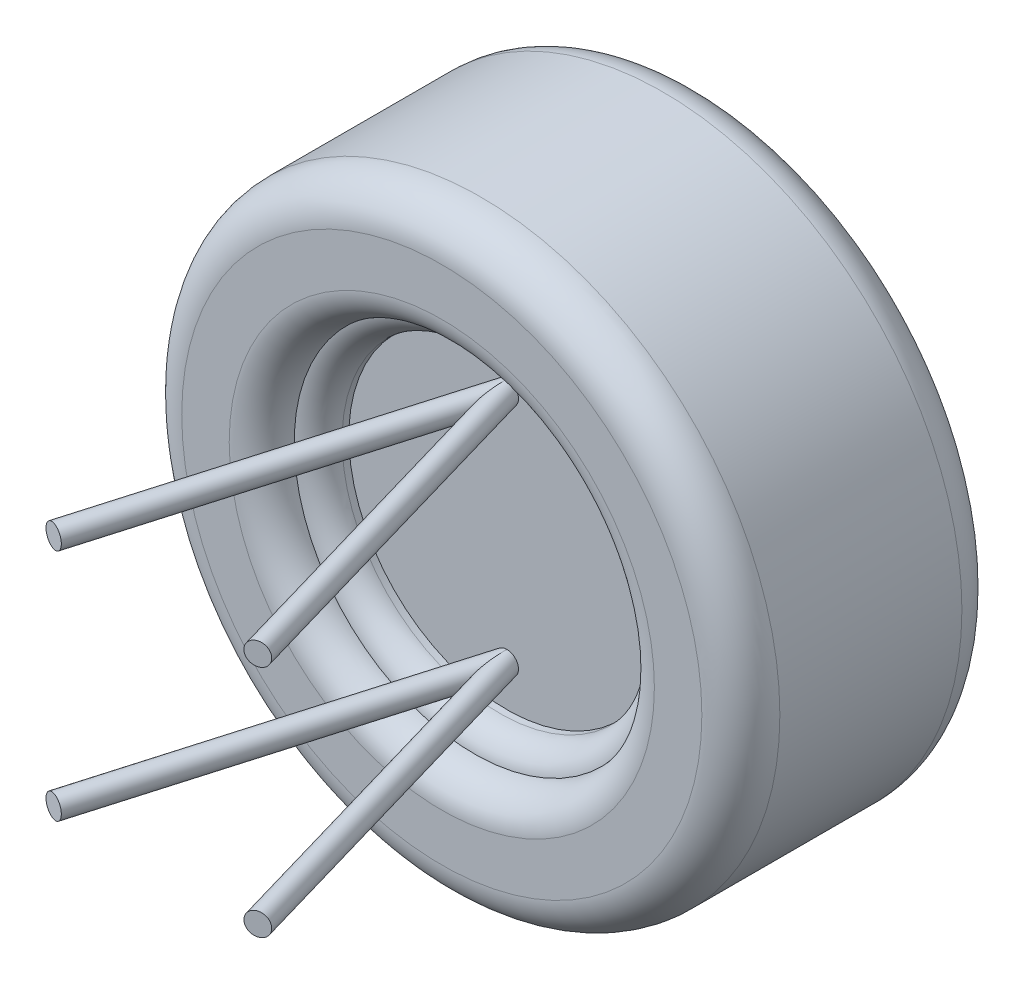
ISO-10303-21;
HEADER;
FILE_DESCRIPTION(('STEP AP214'),'2;1');
FILE_NAME('part.step','',(''),(''),'','','');
FILE_SCHEMA(('AUTOMOTIVE_DESIGN { 1 0 10303 214 1 1 1 1 }'));
ENDSEC;
DATA;
#1=APPLICATION_CONTEXT('core data for automotive mechanical design processes');
#2=APPLICATION_PROTOCOL_DEFINITION('international standard','automotive_design',2000,#1);
#3=PRODUCT_CONTEXT('',#1,'mechanical');
#4=PRODUCT('Part','Part','',(#3));
#5=PRODUCT_RELATED_PRODUCT_CATEGORY('part','',(#4));
#6=PRODUCT_DEFINITION_FORMATION('','',#4);
#7=PRODUCT_DEFINITION_CONTEXT('part definition',#1,'design');
#8=PRODUCT_DEFINITION('design','',#6,#7);
#9=PRODUCT_DEFINITION_SHAPE('','',#8);
#10=(LENGTH_UNIT() NAMED_UNIT(*) SI_UNIT(.MILLI.,.METRE.));
#11=(NAMED_UNIT(*) PLANE_ANGLE_UNIT() SI_UNIT($,.RADIAN.));
#12=(NAMED_UNIT(*) SI_UNIT($,.STERADIAN.) SOLID_ANGLE_UNIT());
#13=UNCERTAINTY_MEASURE_WITH_UNIT(LENGTH_MEASURE(1.E-05),#10,'distance_accuracy_value','');
#14=(GEOMETRIC_REPRESENTATION_CONTEXT(3) GLOBAL_UNCERTAINTY_ASSIGNED_CONTEXT((#13)) GLOBAL_UNIT_ASSIGNED_CONTEXT((#10,
#11,#12)) REPRESENTATION_CONTEXT('',''));
#15=CARTESIAN_POINT('',(0.,0.,0.));
#16=DIRECTION('',(0.,0.,1.));
#17=DIRECTION('',(1.,0.,0.));
#18=AXIS2_PLACEMENT_3D('',#15,#16,#17);
#19=CARTESIAN_POINT('',(78.5,-90.,420.));
#20=DIRECTION('',(-0.27918049436235,0.,-0.960238643029739));
#21=DIRECTION('',(-0.960238643029739,0.,0.27918049436235));
#22=AXIS2_PLACEMENT_3D('',#19,#20,#21);
#23=CYLINDRICAL_SURFACE('',#22,8.65000000000001);
#24=CARTESIAN_POINT('',(78.5,-90.,420.));
#25=DIRECTION('',(0.27918049436235,0.,0.960238643029739));
#26=DIRECTION('',(0.960238643029739,0.,-0.27918049436235));
#27=AXIS2_PLACEMENT_3D('',#24,#25,#26);
#28=CIRCLE('',#27,8.65000000000001);
#29=CARTESIAN_POINT('',(86.8060642622073,-90.,417.585088723766));
#30=VERTEX_POINT('',#29);
#31=EDGE_CURVE('E12',#30,#30,#28,.T.);
#32=ORIENTED_EDGE('',*,*,#31,.F.);
#33=EDGE_LOOP('',(#32));
#34=FACE_BOUND('',#33,.T.);
#35=CARTESIAN_POINT('',(0.,-90.,150.));
#36=DIRECTION('',(0.27918049436235,0.,0.960238643029739));
#37=DIRECTION('',(0.960238643029739,0.,-0.27918049436235));
#38=AXIS2_PLACEMENT_3D('',#35,#36,#37);
#39=CIRCLE('',#38,8.65000000000001);
#40=CARTESIAN_POINT('',(8.30606426220724,-90.,147.585088723766));
#41=VERTEX_POINT('',#40);
#42=EDGE_CURVE('E55',#41,#41,#39,.T.);
#43=ORIENTED_EDGE('',*,*,#42,.T.);
#44=EDGE_LOOP('',(#43));
#45=FACE_BOUND('',#44,.T.);
#46=ADVANCED_FACE('F52',(#34,#45),#23,.T.);
#47=CARTESIAN_POINT('',(78.5,-90.,420.));
#48=DIRECTION('',(0.27918049436235,0.,0.960238643029739));
#49=DIRECTION('',(0.960238643029739,0.,-0.27918049436235));
#50=AXIS2_PLACEMENT_3D('',#47,#48,#49);
#51=PLANE('',#50);
#52=ORIENTED_EDGE('',*,*,#31,.T.);
#53=EDGE_LOOP('',(#52));
#54=FACE_BOUND('',#53,.T.);
#55=ADVANCED_FACE('F67',(#54),#51,.T.);
#56=CARTESIAN_POINT('',(0.,-90.,150.));
#57=DIRECTION('',(0.27918049436235,0.,0.960238643029739));
#58=DIRECTION('',(0.960238643029739,0.,-0.27918049436235));
#59=AXIS2_PLACEMENT_3D('',#56,#57,#58);
#60=PLANE('',#59);
#61=ORIENTED_EDGE('',*,*,#42,.F.);
#62=EDGE_LOOP('',(#61));
#63=FACE_BOUND('',#62,.T.);
#64=ADVANCED_FACE('F65',(#63),#60,.F.);
#65=CLOSED_SHELL('',(#46,#55,#64));
#66=MANIFOLD_SOLID_BREP('B2',#65);
#67=CARTESIAN_POINT('',(0.,-90.,150.));
#68=DIRECTION('',(-0.27918049436235,0.,0.960238643029739));
#69=DIRECTION('',(0.960238643029739,0.,0.27918049436235));
#70=AXIS2_PLACEMENT_3D('',#67,#68,#69);
#71=CYLINDRICAL_SURFACE('',#70,8.65000000000001);
#72=CARTESIAN_POINT('',(0.,-90.,150.));
#73=DIRECTION('',(0.27918049436235,0.,-0.960238643029739));
#74=DIRECTION('',(-0.960238643029739,0.,-0.27918049436235));
#75=AXIS2_PLACEMENT_3D('',#72,#73,#74);
#76=CIRCLE('',#75,8.65000000000001);
#77=CARTESIAN_POINT('',(-8.30606426220724,-90.,147.585088723766));
#78=VERTEX_POINT('',#77);
#79=EDGE_CURVE('E51',#78,#78,#76,.T.);
#80=ORIENTED_EDGE('',*,*,#79,.F.);
#81=EDGE_LOOP('',(#80));
#82=FACE_BOUND('',#81,.T.);
#83=CARTESIAN_POINT('',(-78.4999999999999,-90.,420.));
#84=DIRECTION('',(0.27918049436235,0.,-0.960238643029739));
#85=DIRECTION('',(-0.960238643029739,0.,-0.27918049436235));
#86=AXIS2_PLACEMENT_3D('',#83,#84,#85);
#87=CIRCLE('',#86,8.65000000000001);
#88=CARTESIAN_POINT('',(-86.8060642622072,-90.,417.585088723766));
#89=VERTEX_POINT('',#88);
#90=EDGE_CURVE('E110',#89,#89,#87,.T.);
#91=ORIENTED_EDGE('',*,*,#90,.T.);
#92=EDGE_LOOP('',(#91));
#93=FACE_BOUND('',#92,.T.);
#94=ADVANCED_FACE('F107',(#82,#93),#71,.T.);
#95=CARTESIAN_POINT('',(0.,-90.,150.));
#96=DIRECTION('',(0.27918049436235,0.,-0.960238643029739));
#97=DIRECTION('',(-0.960238643029739,0.,-0.27918049436235));
#98=AXIS2_PLACEMENT_3D('',#95,#96,#97);
#99=PLANE('',#98);
#100=ORIENTED_EDGE('',*,*,#79,.T.);
#101=EDGE_LOOP('',(#100));
#102=FACE_BOUND('',#101,.T.);
#103=ADVANCED_FACE('F122',(#102),#99,.T.);
#104=CARTESIAN_POINT('',(-78.4999999999999,-90.,420.));
#105=DIRECTION('',(0.27918049436235,0.,-0.960238643029739));
#106=DIRECTION('',(-0.960238643029739,0.,-0.27918049436235));
#107=AXIS2_PLACEMENT_3D('',#104,#105,#106);
#108=PLANE('',#107);
#109=ORIENTED_EDGE('',*,*,#90,.F.);
#110=EDGE_LOOP('',(#109));
#111=FACE_BOUND('',#110,.T.);
#112=ADVANCED_FACE('F120',(#111),#108,.F.);
#113=CLOSED_SHELL('',(#94,#103,#112));
#114=MANIFOLD_SOLID_BREP('B7',#113);
#115=CARTESIAN_POINT('',(-78.5,90.,420.));
#116=DIRECTION('',(0.27918049436235,0.,-0.960238643029739));
#117=DIRECTION('',(-0.960238643029739,0.,-0.27918049436235));
#118=AXIS2_PLACEMENT_3D('',#115,#116,#117);
#119=CYLINDRICAL_SURFACE('',#118,8.65000000000001);
#120=CARTESIAN_POINT('',(-78.5,90.,420.));
#121=DIRECTION('',(-0.27918049436235,0.,0.960238643029739));
#122=DIRECTION('',(0.960238643029739,0.,0.27918049436235));
#123=AXIS2_PLACEMENT_3D('',#120,#121,#122);
#124=CIRCLE('',#123,8.65000000000001);
#125=CARTESIAN_POINT('',(-70.1939357377928,90.,422.414911276234));
#126=VERTEX_POINT('',#125);
#127=EDGE_CURVE('E106',#126,#126,#124,.T.);
#128=ORIENTED_EDGE('',*,*,#127,.F.);
#129=EDGE_LOOP('',(#128));
#130=FACE_BOUND('',#129,.T.);
#131=CARTESIAN_POINT('',(0.,90.,150.));
#132=DIRECTION('',(-0.27918049436235,0.,0.960238643029739));
#133=DIRECTION('',(0.960238643029739,0.,0.27918049436235));
#134=AXIS2_PLACEMENT_3D('',#131,#132,#133);
#135=CIRCLE('',#134,8.65000000000001);
#136=CARTESIAN_POINT('',(8.30606426220726,90.,152.414911276234));
#137=VERTEX_POINT('',#136);
#138=EDGE_CURVE('E165',#137,#137,#135,.T.);
#139=ORIENTED_EDGE('',*,*,#138,.T.);
#140=EDGE_LOOP('',(#139));
#141=FACE_BOUND('',#140,.T.);
#142=ADVANCED_FACE('F162',(#130,#141),#119,.T.);
#143=CARTESIAN_POINT('',(-78.5,90.,420.));
#144=DIRECTION('',(-0.27918049436235,0.,0.960238643029739));
#145=DIRECTION('',(0.960238643029739,0.,0.27918049436235));
#146=AXIS2_PLACEMENT_3D('',#143,#144,#145);
#147=PLANE('',#146);
#148=ORIENTED_EDGE('',*,*,#127,.T.);
#149=EDGE_LOOP('',(#148));
#150=FACE_BOUND('',#149,.T.);
#151=ADVANCED_FACE('F177',(#150),#147,.T.);
#152=CARTESIAN_POINT('',(0.,90.,150.));
#153=DIRECTION('',(-0.27918049436235,0.,0.960238643029739));
#154=DIRECTION('',(0.960238643029739,0.,0.27918049436235));
#155=AXIS2_PLACEMENT_3D('',#152,#153,#154);
#156=PLANE('',#155);
#157=ORIENTED_EDGE('',*,*,#138,.F.);
#158=EDGE_LOOP('',(#157));
#159=FACE_BOUND('',#158,.T.);
#160=ADVANCED_FACE('F175',(#159),#156,.F.);
#161=CLOSED_SHELL('',(#142,#151,#160));
#162=MANIFOLD_SOLID_BREP('B46',#161);
#163=CARTESIAN_POINT('',(0.,90.,150.));
#164=DIRECTION('',(0.27918049436235,0.,0.960238643029739));
#165=DIRECTION('',(0.960238643029739,0.,-0.27918049436235));
#166=AXIS2_PLACEMENT_3D('',#163,#164,#165);
#167=CYLINDRICAL_SURFACE('',#166,8.65000000000001);
#168=CARTESIAN_POINT('',(0.,90.,150.));
#169=DIRECTION('',(-0.27918049436235,0.,-0.960238643029739));
#170=DIRECTION('',(-0.960238643029739,0.,0.27918049436235));
#171=AXIS2_PLACEMENT_3D('',#168,#169,#170);
#172=CIRCLE('',#171,8.65000000000001);
#173=CARTESIAN_POINT('',(-8.30606426220725,90.,152.414911276234));
#174=VERTEX_POINT('',#173);
#175=EDGE_CURVE('E161',#174,#174,#172,.T.);
#176=ORIENTED_EDGE('',*,*,#175,.F.);
#177=EDGE_LOOP('',(#176));
#178=FACE_BOUND('',#177,.T.);
#179=CARTESIAN_POINT('',(78.5,90.,420.));
#180=DIRECTION('',(-0.27918049436235,0.,-0.960238643029739));
#181=DIRECTION('',(-0.960238643029739,0.,0.27918049436235));
#182=AXIS2_PLACEMENT_3D('',#179,#180,#181);
#183=CIRCLE('',#182,8.65000000000001);
#184=CARTESIAN_POINT('',(70.1939357377928,90.,422.414911276234));
#185=VERTEX_POINT('',#184);
#186=EDGE_CURVE('E221',#185,#185,#183,.T.);
#187=ORIENTED_EDGE('',*,*,#186,.T.);
#188=EDGE_LOOP('',(#187));
#189=FACE_BOUND('',#188,.T.);
#190=ADVANCED_FACE('F218',(#178,#189),#167,.T.);
#191=CARTESIAN_POINT('',(0.,90.,150.));
#192=DIRECTION('',(-0.27918049436235,0.,-0.960238643029739));
#193=DIRECTION('',(-0.960238643029739,0.,0.27918049436235));
#194=AXIS2_PLACEMENT_3D('',#191,#192,#193);
#195=PLANE('',#194);
#196=ORIENTED_EDGE('',*,*,#175,.T.);
#197=EDGE_LOOP('',(#196));
#198=FACE_BOUND('',#197,.T.);
#199=ADVANCED_FACE('F233',(#198),#195,.T.);
#200=CARTESIAN_POINT('',(78.5,90.,420.));
#201=DIRECTION('',(-0.27918049436235,0.,-0.960238643029739));
#202=DIRECTION('',(-0.960238643029739,0.,0.27918049436235));
#203=AXIS2_PLACEMENT_3D('',#200,#201,#202);
#204=PLANE('',#203);
#205=ORIENTED_EDGE('',*,*,#186,.F.);
#206=EDGE_LOOP('',(#205));
#207=FACE_BOUND('',#206,.T.);
#208=ADVANCED_FACE('F231',(#207),#204,.F.);
#209=CLOSED_SHELL('',(#190,#199,#208));
#210=MANIFOLD_SOLID_BREP('B101',#209);
#211=CARTESIAN_POINT('',(0.,0.,200.));
#212=DIRECTION('',(0.,0.,-1.));
#213=DIRECTION('',(-1.,0.,0.));
#214=AXIS2_PLACEMENT_3D('',#211,#212,#213);
#215=CYLINDRICAL_SURFACE('',#214,230.);
#216=DIRECTION('',(0.,0.,-1.));
#217=VECTOR('',#216,1.);
#218=CARTESIAN_POINT('',(52.6980728051392,-223.881471146284,200.));
#219=LINE('',#218,#217);
#220=CARTESIAN_POINT('',(52.6980728051392,-223.881471146284,153.5));
#221=VERTEX_POINT('',#220);
#222=CARTESIAN_POINT('',(52.6980728051392,-223.881471146284,46.5));
#223=VERTEX_POINT('',#222);
#224=EDGE_CURVE('E398',#221,#223,#219,.T.);
#225=ORIENTED_EDGE('',*,*,#224,.T.);
#226=CARTESIAN_POINT('',(0.,0.,46.5));
#227=DIRECTION('',(0.,0.,1.));
#228=DIRECTION('',(1.,0.,0.));
#229=AXIS2_PLACEMENT_3D('',#226,#227,#228);
#230=CIRCLE('',#229,230.);
#231=CARTESIAN_POINT('',(-52.6980728051392,-223.881471146284,46.5));
#232=VERTEX_POINT('',#231);
#233=EDGE_CURVE('E400',#223,#232,#230,.F.);
#234=ORIENTED_EDGE('',*,*,#233,.T.);
#235=DIRECTION('',(0.,0.,-1.));
#236=VECTOR('',#235,1.);
#237=CARTESIAN_POINT('',(-52.6980728051392,-223.881471146284,200.));
#238=LINE('',#237,#236);
#239=CARTESIAN_POINT('',(-52.6980728051392,-223.881471146284,153.5));
#240=VERTEX_POINT('',#239);
#241=EDGE_CURVE('E394',#232,#240,#238,.F.);
#242=ORIENTED_EDGE('',*,*,#241,.T.);
#243=CARTESIAN_POINT('',(0.,0.,153.5));
#244=DIRECTION('',(0.,0.,1.));
#245=DIRECTION('',(1.,0.,0.));
#246=AXIS2_PLACEMENT_3D('',#243,#244,#245);
#247=CIRCLE('',#246,230.);
#248=EDGE_CURVE('E396',#240,#221,#247,.T.);
#249=ORIENTED_EDGE('',*,*,#248,.T.);
#250=EDGE_LOOP('',(#225,#234,#242,#249));
#251=FACE_BOUND('',#250,.T.);
#252=CARTESIAN_POINT('',(0.,0.,30.));
#253=DIRECTION('',(0.,0.,1.));
#254=DIRECTION('',(1.,0.,0.));
#255=AXIS2_PLACEMENT_3D('',#252,#253,#254);
#256=CIRCLE('',#255,230.);
#257=CARTESIAN_POINT('',(230.,0.,30.));
#258=VERTEX_POINT('',#257);
#259=EDGE_CURVE('E385',#258,#258,#256,.T.);
#260=ORIENTED_EDGE('',*,*,#259,.T.);
#261=EDGE_LOOP('',(#260));
#262=FACE_BOUND('',#261,.T.);
#263=CARTESIAN_POINT('',(0.,0.,170.));
#264=DIRECTION('',(0.,0.,1.));
#265=DIRECTION('',(1.,0.,0.));
#266=AXIS2_PLACEMENT_3D('',#263,#264,#265);
#267=CIRCLE('',#266,230.);
#268=CARTESIAN_POINT('',(230.,0.,170.));
#269=VERTEX_POINT('',#268);
#270=EDGE_CURVE('E382',#269,#269,#267,.F.);
#271=ORIENTED_EDGE('',*,*,#270,.T.);
#272=EDGE_LOOP('',(#271));
#273=FACE_BOUND('',#272,.T.);
#274=ADVANCED_FACE('F264',(#251,#262,#273),#215,.T.);
#275=CARTESIAN_POINT('',(0.,0.,200.));
#276=DIRECTION('',(0.,0.,1.));
#277=DIRECTION('',(1.,0.,0.));
#278=AXIS2_PLACEMENT_3D('',#275,#276,#277);
#279=PLANE('',#278);
#280=CARTESIAN_POINT('',(0.,0.,200.));
#281=DIRECTION('',(0.,0.,1.));
#282=DIRECTION('',(1.,0.,0.));
#283=AXIS2_PLACEMENT_3D('',#280,#281,#282);
#284=CIRCLE('',#283,200.);
#285=CARTESIAN_POINT('',(200.,0.,200.));
#286=VERTEX_POINT('',#285);
#287=EDGE_CURVE('E391',#286,#286,#284,.T.);
#288=ORIENTED_EDGE('',*,*,#287,.T.);
#289=EDGE_LOOP('',(#288));
#290=FACE_BOUND('',#289,.T.);
#291=CARTESIAN_POINT('',(0.,0.,200.));
#292=DIRECTION('',(0.,0.,1.));
#293=DIRECTION('',(1.,0.,0.));
#294=AXIS2_PLACEMENT_3D('',#291,#292,#293);
#295=CIRCLE('',#294,163.5);
#296=CARTESIAN_POINT('',(163.5,0.,200.));
#297=VERTEX_POINT('',#296);
#298=EDGE_CURVE('E373',#297,#297,#295,.F.);
#299=ORIENTED_EDGE('',*,*,#298,.T.);
#300=EDGE_LOOP('',(#299));
#301=FACE_BOUND('',#300,.T.);
#302=ADVANCED_FACE('F465',(#290,#301),#279,.T.);
#303=CARTESIAN_POINT('',(0.,0.,0.));
#304=DIRECTION('',(0.,0.,1.));
#305=DIRECTION('',(1.,0.,0.));
#306=AXIS2_PLACEMENT_3D('',#303,#304,#305);
#307=PLANE('',#306);
#308=CARTESIAN_POINT('',(0.,0.,0.));
#309=DIRECTION('',(0.,0.,1.));
#310=DIRECTION('',(1.,0.,0.));
#311=AXIS2_PLACEMENT_3D('',#308,#309,#310);
#312=CIRCLE('',#311,200.);
#313=CARTESIAN_POINT('',(200.,0.,0.));
#314=VERTEX_POINT('',#313);
#315=EDGE_CURVE('E388',#314,#314,#312,.F.);
#316=ORIENTED_EDGE('',*,*,#315,.T.);
#317=EDGE_LOOP('',(#316));
#318=FACE_BOUND('',#317,.T.);
#319=CARTESIAN_POINT('',(0.,0.,0.));
#320=DIRECTION('',(0.,0.,1.));
#321=DIRECTION('',(1.,0.,0.));
#322=AXIS2_PLACEMENT_3D('',#319,#320,#321);
#323=CIRCLE('',#322,156.5);
#324=CARTESIAN_POINT('',(156.5,0.,0.));
#325=VERTEX_POINT('',#324);
#326=EDGE_CURVE('E376',#325,#325,#323,.T.);
#327=ORIENTED_EDGE('',*,*,#326,.T.);
#328=EDGE_LOOP('',(#327));
#329=FACE_BOUND('',#328,.T.);
#330=ADVANCED_FACE('F471',(#318,#329),#307,.F.);
#331=CARTESIAN_POINT('',(0.,0.,150.));
#332=DIRECTION('',(0.,0.,1.));
#333=DIRECTION('',(1.,0.,0.));
#334=AXIS2_PLACEMENT_3D('',#331,#332,#333);
#335=CYLINDRICAL_SURFACE('',#334,121.5);
#336=CARTESIAN_POINT('',(0.,0.,155.226280066715));
#337=DIRECTION('',(0.,0.,1.));
#338=DIRECTION('',(1.,0.,0.));
#339=AXIS2_PLACEMENT_3D('',#336,#337,#338);
#340=CIRCLE('',#339,121.5);
#341=CARTESIAN_POINT('',(121.5,0.,155.226280066715));
#342=VERTEX_POINT('',#341);
#343=EDGE_CURVE('E379',#342,#342,#340,.T.);
#344=ORIENTED_EDGE('',*,*,#343,.T.);
#345=EDGE_LOOP('',(#344));
#346=FACE_BOUND('',#345,.T.);
#347=CARTESIAN_POINT('',(0.,0.,150.));
#348=DIRECTION('',(0.,0.,1.));
#349=DIRECTION('',(1.,0.,0.));
#350=AXIS2_PLACEMENT_3D('',#347,#348,#349);
#351=CIRCLE('',#350,121.5);
#352=CARTESIAN_POINT('',(121.5,0.,150.));
#353=VERTEX_POINT('',#352);
#354=EDGE_CURVE('E363',#353,#353,#351,.T.);
#355=ORIENTED_EDGE('',*,*,#354,.F.);
#356=EDGE_LOOP('',(#355));
#357=FACE_BOUND('',#356,.T.);
#358=ADVANCED_FACE('F510',(#346,#357),#335,.F.);
#359=CARTESIAN_POINT('',(0.,0.,150.));
#360=DIRECTION('',(0.,0.,1.));
#361=DIRECTION('',(1.,0.,0.));
#362=AXIS2_PLACEMENT_3D('',#359,#360,#361);
#363=PLANE('',#362);
#364=ORIENTED_EDGE('',*,*,#354,.T.);
#365=EDGE_LOOP('',(#364));
#366=FACE_BOUND('',#365,.T.);
#367=ADVANCED_FACE('F513',(#366),#363,.T.);
#368=CARTESIAN_POINT('',(0.,0.,25.));
#369=DIRECTION('',(0.,0.,-1.));
#370=DIRECTION('',(-1.,0.,0.));
#371=AXIS2_PLACEMENT_3D('',#368,#369,#370);
#372=PLANE('',#371);
#373=CARTESIAN_POINT('',(0.,0.,25.));
#374=DIRECTION('',(0.,0.,-1.));
#375=DIRECTION('',(-1.,0.,0.));
#376=AXIS2_PLACEMENT_3D('',#373,#374,#375);
#377=CIRCLE('',#376,131.5);
#378=CARTESIAN_POINT('',(-131.5,0.,25.));
#379=VERTEX_POINT('',#378);
#380=EDGE_CURVE('E360',#379,#379,#377,.T.);
#381=ORIENTED_EDGE('',*,*,#380,.T.);
#382=EDGE_LOOP('',(#381));
#383=FACE_BOUND('',#382,.T.);
#384=ADVANCED_FACE('F481',(#383),#372,.T.);
#385=CARTESIAN_POINT('',(0.,0.,175.));
#386=DIRECTION('',(0.,0.,1.));
#387=DIRECTION('',(1.,0.,0.));
#388=AXIS2_PLACEMENT_3D('',#385,#386,#387);
#389=TOROIDAL_SURFACE('',#388,163.5,25.);
#390=ORIENTED_EDGE('',*,*,#298,.F.);
#391=EDGE_LOOP('',(#390));
#392=FACE_BOUND('',#391,.T.);
#393=CARTESIAN_POINT('',(0.,0.,175.));
#394=DIRECTION('',(0.,0.,1.));
#395=DIRECTION('',(1.,0.,0.));
#396=AXIS2_PLACEMENT_3D('',#393,#394,#395);
#397=CIRCLE('',#396,138.5);
#398=CARTESIAN_POINT('',(138.5,0.,175.));
#399=VERTEX_POINT('',#398);
#400=EDGE_CURVE('E370',#399,#399,#397,.T.);
#401=ORIENTED_EDGE('',*,*,#400,.F.);
#402=EDGE_LOOP('',(#401));
#403=FACE_BOUND('',#402,.T.);
#404=ADVANCED_FACE('F477',(#392,#403),#389,.T.);
#405=CARTESIAN_POINT('',(0.,0.,25.));
#406=DIRECTION('',(0.,0.,1.));
#407=DIRECTION('',(1.,0.,0.));
#408=AXIS2_PLACEMENT_3D('',#405,#406,#407);
#409=TOROIDAL_SURFACE('',#408,156.5,25.);
#410=ORIENTED_EDGE('',*,*,#326,.F.);
#411=EDGE_LOOP('',(#410));
#412=FACE_BOUND('',#411,.T.);
#413=ORIENTED_EDGE('',*,*,#380,.F.);
#414=EDGE_LOOP('',(#413));
#415=FACE_BOUND('',#414,.T.);
#416=ADVANCED_FACE('F480',(#412,#415),#409,.T.);
#417=CARTESIAN_POINT('',(0.,0.,155.226280066715));
#418=DIRECTION('',(0.,0.,1.));
#419=DIRECTION('',(1.,0.,0.));
#420=AXIS2_PLACEMENT_3D('',#417,#418,#419);
#421=TOROIDAL_SURFACE('',#420,141.5,20.);
#422=ORIENTED_EDGE('',*,*,#400,.T.);
#423=EDGE_LOOP('',(#422));
#424=FACE_BOUND('',#423,.T.);
#425=ORIENTED_EDGE('',*,*,#343,.F.);
#426=EDGE_LOOP('',(#425));
#427=FACE_BOUND('',#426,.T.);
#428=ADVANCED_FACE('F485',(#424,#427),#421,.T.);
#429=CARTESIAN_POINT('',(0.,0.,30.));
#430=DIRECTION('',(0.,0.,1.));
#431=DIRECTION('',(1.,0.,0.));
#432=AXIS2_PLACEMENT_3D('',#429,#430,#431);
#433=TOROIDAL_SURFACE('',#432,200.,30.);
#434=ORIENTED_EDGE('',*,*,#315,.F.);
#435=EDGE_LOOP('',(#434));
#436=FACE_BOUND('',#435,.T.);
#437=ORIENTED_EDGE('',*,*,#259,.F.);
#438=EDGE_LOOP('',(#437));
#439=FACE_BOUND('',#438,.T.);
#440=ADVANCED_FACE('F488',(#436,#439),#433,.T.);
#441=CARTESIAN_POINT('',(0.,0.,170.));
#442=DIRECTION('',(0.,0.,1.));
#443=DIRECTION('',(1.,0.,0.));
#444=AXIS2_PLACEMENT_3D('',#441,#442,#443);
#445=TOROIDAL_SURFACE('',#444,200.,30.);
#446=ORIENTED_EDGE('',*,*,#270,.F.);
#447=EDGE_LOOP('',(#446));
#448=FACE_BOUND('',#447,.T.);
#449=ORIENTED_EDGE('',*,*,#287,.F.);
#450=EDGE_LOOP('',(#449));
#451=FACE_BOUND('',#450,.T.);
#452=ADVANCED_FACE('F432',(#448,#451),#445,.T.);
#453=CARTESIAN_POINT('',(-50.,-234.499443206436,150.));
#454=DIRECTION('',(1.,0.,0.));
#455=DIRECTION('',(0.,1.,0.));
#456=AXIS2_PLACEMENT_3D('',#453,#454,#455);
#457=PLANE('',#456);
#458=CARTESIAN_POINT('',(-50.0000000000006,-228.083866154535,150.));
#459=CARTESIAN_POINT('',(-50.0000000000003,-227.949688515719,150.000038509189));
#460=CARTESIAN_POINT('',(-50.0000000000001,-227.816307759366,150.007335608264));
#461=CARTESIAN_POINT('',(-49.9999999999999,-227.551140074784,150.036446979247));
#462=CARTESIAN_POINT('',(-49.9999999999999,-227.419353145795,150.058261244235));
#463=CARTESIAN_POINT('',(-50.,-227.28836309851,150.087334092189));
#464=B_SPLINE_CURVE_WITH_KNOTS('',3,(#458,#459,#460,#461,#462,#463),.UNSPECIFIED.,.F.,.F.,(4,2,
4),(0.,0.400740644783794,0.801481098548692),.UNSPECIFIED.);
#465=CARTESIAN_POINT('',(-50.,-228.083866154535,150.));
#466=VERTEX_POINT('',#465);
#467=CARTESIAN_POINT('',(-50.,-227.28836309851,150.087334092189));
#468=VERTEX_POINT('',#467);
#469=EDGE_CURVE('E277',#466,#468,#464,.T.);
#470=ORIENTED_EDGE('',*,*,#469,.T.);
#471=DIRECTION('',(0.,0.,1.));
#472=VECTOR('',#471,1.);
#473=CARTESIAN_POINT('',(-50.,-227.28836309851,50.));
#474=LINE('',#473,#472);
#475=CARTESIAN_POINT('',(-50.,-227.28836309851,49.9126659078108));
#476=VERTEX_POINT('',#475);
#477=EDGE_CURVE('E285',#468,#476,#474,.F.);
#478=ORIENTED_EDGE('',*,*,#477,.T.);
#479=CARTESIAN_POINT('',(-50.,-227.28836309851,49.9126659078108));
#480=CARTESIAN_POINT('',(-50.,-227.419353145795,49.941738755765));
#481=CARTESIAN_POINT('',(-50.,-227.551140074784,49.9635530207533));
#482=CARTESIAN_POINT('',(-50.,-227.816307759366,49.9926643917362));
#483=CARTESIAN_POINT('',(-50.,-227.949688515719,49.9999614908109));
#484=CARTESIAN_POINT('',(-50.,-228.083866154535,50.));
#485=B_SPLINE_CURVE_WITH_KNOTS('',3,(#479,#480,#481,#482,#483,#484),.UNSPECIFIED.,.F.,.F.,(4,2,
4),(0.,0.400740453764841,0.801481098548581),.UNSPECIFIED.);
#486=CARTESIAN_POINT('',(-50.,-228.083866154535,50.));
#487=VERTEX_POINT('',#486);
#488=EDGE_CURVE('E409',#476,#487,#485,.T.);
#489=ORIENTED_EDGE('',*,*,#488,.T.);
#490=DIRECTION('',(0.,-1.,0.));
#491=VECTOR('',#490,1.);
#492=CARTESIAN_POINT('',(-50.,-234.499443206436,50.));
#493=LINE('',#492,#491);
#494=CARTESIAN_POINT('',(-50.,-234.499443206436,50.));
#495=VERTEX_POINT('',#494);
#496=EDGE_CURVE('E358',#487,#495,#493,.T.);
#497=ORIENTED_EDGE('',*,*,#496,.T.);
#498=DIRECTION('',(0.,0.,-1.));
#499=VECTOR('',#498,1.);
#500=CARTESIAN_POINT('',(-50.,-234.499443206436,150.));
#501=LINE('',#500,#499);
#502=CARTESIAN_POINT('',(-50.,-234.499443206436,150.));
#503=VERTEX_POINT('',#502);
#504=EDGE_CURVE('E350',#503,#495,#501,.T.);
#505=ORIENTED_EDGE('',*,*,#504,.F.);
#506=DIRECTION('',(0.,-1.,0.));
#507=VECTOR('',#506,1.);
#508=CARTESIAN_POINT('',(-50.,-234.499443206436,150.));
#509=LINE('',#508,#507);
#510=EDGE_CURVE('E334',#466,#503,#509,.T.);
#511=ORIENTED_EDGE('',*,*,#510,.F.);
#512=EDGE_LOOP('',(#470,#478,#489,#497,#505,#511));
#513=FACE_BOUND('',#512,.T.);
#514=ADVANCED_FACE('F356',(#513),#457,.F.);
#515=CARTESIAN_POINT('',(-50.,-234.499443206436,150.));
#516=DIRECTION('',(0.,1.,0.));
#517=DIRECTION('',(-1.,0.,0.));
#518=AXIS2_PLACEMENT_3D('',#515,#516,#517);
#519=PLANE('',#518);
#520=DIRECTION('',(1.,0.,0.));
#521=VECTOR('',#520,1.);
#522=CARTESIAN_POINT('',(-50.,-234.499443206436,50.));
#523=LINE('',#522,#521);
#524=CARTESIAN_POINT('',(50.,-234.499443206436,50.));
#525=VERTEX_POINT('',#524);
#526=EDGE_CURVE('E653',#495,#525,#523,.T.);
#527=ORIENTED_EDGE('',*,*,#526,.T.);
#528=DIRECTION('',(0.,0.,-1.));
#529=VECTOR('',#528,1.);
#530=CARTESIAN_POINT('',(50.,-234.499443206436,150.));
#531=LINE('',#530,#529);
#532=CARTESIAN_POINT('',(50.,-234.499443206436,150.));
#533=VERTEX_POINT('',#532);
#534=EDGE_CURVE('E352',#533,#525,#531,.T.);
#535=ORIENTED_EDGE('',*,*,#534,.F.);
#536=DIRECTION('',(1.,0.,0.));
#537=VECTOR('',#536,1.);
#538=CARTESIAN_POINT('',(-50.,-234.499443206436,150.));
#539=LINE('',#538,#537);
#540=EDGE_CURVE('E338',#503,#533,#539,.T.);
#541=ORIENTED_EDGE('',*,*,#540,.F.);
#542=ORIENTED_EDGE('',*,*,#504,.T.);
#543=EDGE_LOOP('',(#527,#535,#541,#542));
#544=FACE_BOUND('',#543,.T.);
#545=ADVANCED_FACE('F349',(#544),#519,.F.);
#546=CARTESIAN_POINT('',(50.,-234.499443206436,150.));
#547=DIRECTION('',(-1.,0.,0.));
#548=DIRECTION('',(0.,0.,1.));
#549=AXIS2_PLACEMENT_3D('',#546,#547,#548);
#550=PLANE('',#549);
#551=CARTESIAN_POINT('',(50.,-228.083866154535,50.));
#552=CARTESIAN_POINT('',(50.,-227.94968851572,49.999961490811));
#553=CARTESIAN_POINT('',(50.,-227.816307759367,49.9926643917362));
#554=CARTESIAN_POINT('',(50.,-227.551140074784,49.9635530207533));
#555=CARTESIAN_POINT('',(50.,-227.419353145795,49.941738755765));
#556=CARTESIAN_POINT('',(50.,-227.28836309851,49.9126659078108));
#557=B_SPLINE_CURVE_WITH_KNOTS('',3,(#551,#552,#553,#554,#555,#556),.UNSPECIFIED.,.F.,.F.,(4,2,
4),(0.,0.40074064478385,0.801481098548803),.UNSPECIFIED.);
#558=CARTESIAN_POINT('',(50.,-228.083866154535,50.));
#559=VERTEX_POINT('',#558);
#560=CARTESIAN_POINT('',(50.,-227.28836309851,49.9126659078108));
#561=VERTEX_POINT('',#560);
#562=EDGE_CURVE('E416',#559,#561,#557,.T.);
#563=ORIENTED_EDGE('',*,*,#562,.T.);
#564=DIRECTION('',(0.,0.,1.));
#565=VECTOR('',#564,1.);
#566=CARTESIAN_POINT('',(50.,-227.28836309851,150.));
#567=LINE('',#566,#565);
#568=CARTESIAN_POINT('',(50.,-227.28836309851,150.087334092189));
#569=VERTEX_POINT('',#568);
#570=EDGE_CURVE('E292',#561,#569,#567,.T.);
#571=ORIENTED_EDGE('',*,*,#570,.T.);
#572=CARTESIAN_POINT('',(50.,-227.28836309851,150.087334092189));
#573=CARTESIAN_POINT('',(50.,-227.419353145795,150.058261244235));
#574=CARTESIAN_POINT('',(50.,-227.551140074784,150.036446979247));
#575=CARTESIAN_POINT('',(50.,-227.816307759367,150.007335608264));
#576=CARTESIAN_POINT('',(50.,-227.94968851572,150.000038509189));
#577=CARTESIAN_POINT('',(50.,-228.083866154535,150.));
#578=B_SPLINE_CURVE_WITH_KNOTS('',3,(#572,#573,#574,#575,#576,#577),.UNSPECIFIED.,.F.,.F.,(4,2,
4),(0.,0.400740453764953,0.80148109854883),.UNSPECIFIED.);
#579=CARTESIAN_POINT('',(50.,-228.083866154535,150.));
#580=VERTEX_POINT('',#579);
#581=EDGE_CURVE('E216',#569,#580,#578,.T.);
#582=ORIENTED_EDGE('',*,*,#581,.T.);
#583=DIRECTION('',(0.,1.,0.));
#584=VECTOR('',#583,1.);
#585=CARTESIAN_POINT('',(50.,-234.499443206436,150.));
#586=LINE('',#585,#584);
#587=EDGE_CURVE('E354',#533,#580,#586,.T.);
#588=ORIENTED_EDGE('',*,*,#587,.F.);
#589=ORIENTED_EDGE('',*,*,#534,.T.);
#590=DIRECTION('',(0.,1.,0.));
#591=VECTOR('',#590,1.);
#592=CARTESIAN_POINT('',(50.,-234.499443206436,50.));
#593=LINE('',#592,#591);
#594=EDGE_CURVE('E345',#525,#559,#593,.T.);
#595=ORIENTED_EDGE('',*,*,#594,.T.);
#596=EDGE_LOOP('',(#563,#571,#582,#588,#589,#595));
#597=FACE_BOUND('',#596,.T.);
#598=ADVANCED_FACE('F577',(#597),#550,.F.);
#599=CARTESIAN_POINT('',(0.,0.,150.));
#600=DIRECTION('',(0.,0.,1.));
#601=DIRECTION('',(1.,0.,0.));
#602=AXIS2_PLACEMENT_3D('',#599,#600,#601);
#603=PLANE('',#602);
#604=ORIENTED_EDGE('',*,*,#587,.T.);
#605=CARTESIAN_POINT('',(0.,0.,150.));
#606=DIRECTION('',(0.,0.,1.));
#607=DIRECTION('',(1.,0.,0.));
#608=AXIS2_PLACEMENT_3D('',#605,#606,#607);
#609=CIRCLE('',#608,233.5);
#610=EDGE_CURVE('E341',#580,#466,#609,.F.);
#611=ORIENTED_EDGE('',*,*,#610,.T.);
#612=ORIENTED_EDGE('',*,*,#510,.T.);
#613=ORIENTED_EDGE('',*,*,#540,.T.);
#614=EDGE_LOOP('',(#604,#611,#612,#613));
#615=FACE_BOUND('',#614,.T.);
#616=ADVANCED_FACE('F337',(#615),#603,.T.);
#617=CARTESIAN_POINT('',(0.,0.,50.));
#618=DIRECTION('',(0.,0.,1.));
#619=DIRECTION('',(1.,0.,0.));
#620=AXIS2_PLACEMENT_3D('',#617,#618,#619);
#621=PLANE('',#620);
#622=ORIENTED_EDGE('',*,*,#496,.F.);
#623=CARTESIAN_POINT('',(0.,0.,50.));
#624=DIRECTION('',(0.,0.,1.));
#625=DIRECTION('',(1.,0.,0.));
#626=AXIS2_PLACEMENT_3D('',#623,#624,#625);
#627=CIRCLE('',#626,233.5);
#628=EDGE_CURVE('E403',#487,#559,#627,.T.);
#629=ORIENTED_EDGE('',*,*,#628,.T.);
#630=ORIENTED_EDGE('',*,*,#594,.F.);
#631=ORIENTED_EDGE('',*,*,#526,.F.);
#632=EDGE_LOOP('',(#622,#629,#630,#631));
#633=FACE_BOUND('',#632,.T.);
#634=ADVANCED_FACE('F462',(#633),#621,.F.);
#635=CARTESIAN_POINT('',(0.,0.,153.5));
#636=DIRECTION('',(0.,0.,1.));
#637=DIRECTION('',(1.,0.,0.));
#638=AXIS2_PLACEMENT_3D('',#635,#636,#637);
#639=TOROIDAL_SURFACE('',#638,233.5,3.5);
#640=ORIENTED_EDGE('',*,*,#610,.F.);
#641=ORIENTED_EDGE('',*,*,#581,.F.);
#642=CARTESIAN_POINT('',(50.,-227.28836309851,150.087334092189));
#643=CARTESIAN_POINT('',(49.9999833339921,-227.198101030439,150.107388141883));
#644=CARTESIAN_POINT('',(50.0034904303298,-227.108633574909,150.130719149857));
#645=CARTESIAN_POINT('',(50.0170587941395,-226.932119662158,150.183275051126));
#646=CARTESIAN_POINT('',(50.0271083810547,-226.845069178063,150.212489376634));
#647=CARTESIAN_POINT('',(50.0531265854456,-226.674844562084,150.275874011281));
#648=CARTESIAN_POINT('',(50.0690282800651,-226.591638133432,150.309985724645));
#649=CARTESIAN_POINT('',(50.1062371269356,-226.42848993243,150.382802760246));
#650=CARTESIAN_POINT('',(50.1275471853324,-226.348549942175,150.42151054618));
#651=CARTESIAN_POINT('',(50.2089753706786,-226.080708587897,150.561078469317));
#652=CARTESIAN_POINT('',(50.2810924398464,-225.901453357761,150.671839221521));
#653=CARTESIAN_POINT('',(50.4476763216132,-225.565343441509,150.910447437272));
#654=CARTESIAN_POINT('',(50.5422543980106,-225.408606714747,151.038378538883));
#655=CARTESIAN_POINT('',(50.7165000836824,-225.162979738675,151.264535256465));
#656=CARTESIAN_POINT('',(50.7917668722558,-225.068075500215,151.359750100191));
#657=CARTESIAN_POINT('',(50.9491285206448,-224.888930062654,151.554550161564));
#658=CARTESIAN_POINT('',(51.0312260484157,-224.804693062675,151.654137079616));
#659=CARTESIAN_POINT('',(51.2011291718393,-224.646648928826,151.856618098956));
#660=CARTESIAN_POINT('',(51.2889347263317,-224.572841719759,151.959512176392));
#661=CARTESIAN_POINT('',(51.4693555950518,-224.435410808075,152.167762787809));
#662=CARTESIAN_POINT('',(51.5619699325746,-224.371785048153,152.273118819374));
#663=CARTESIAN_POINT('',(51.8188537581699,-224.212621248619,152.561458461987));
#664=CARTESIAN_POINT('',(51.9871286612776,-224.12667750199,152.746227853174));
#665=CARTESIAN_POINT('',(52.3325225858818,-223.983540303617,153.117914357784));
#666=CARTESIAN_POINT('',(52.5096241131287,-223.926292287994,153.304826698579));
#667=CARTESIAN_POINT('',(52.6926647805736,-223.882747511171,153.494401279123));
#668=CARTESIAN_POINT('',(52.6953684316031,-223.88210771717,153.497200657298));
#669=CARTESIAN_POINT('',(52.6980728051392,-223.881471146284,153.5));
#670=B_SPLINE_CURVE_WITH_KNOTS('',3,(#642,#643,#644,#645,#646,#647,#648,#649,#650,#651,#652,
#653,#654,#655,#656,#657,#658,#659,#660,#661,#662,#663,#664,#665,#666,#667,#668,#669),
.UNSPECIFIED.,.F.,.F.,(4,2,2,2,2,2,2,2,2,2,2,2,2,4),(0.,0.277165649765089,0.553837817187259,
0.827439670966983,1.10118885517529,1.76540242654356,2.43297755002732,2.89461356221411,
3.35643073466775,3.81824457733575,4.2799649858037,5.07091076261239,5.86034682514667,
5.8721789888751),.UNSPECIFIED.);
#671=EDGE_CURVE('E269',#221,#569,#670,.F.);
#672=ORIENTED_EDGE('',*,*,#671,.F.);
#673=ORIENTED_EDGE('',*,*,#248,.F.);
#674=CARTESIAN_POINT('',(-50.,-227.28836309851,150.087334092189));
#675=CARTESIAN_POINT('',(-49.9999833339921,-227.198101030439,150.107388141883));
#676=CARTESIAN_POINT('',(-50.0034904303298,-227.108633574909,150.130719149857));
#677=CARTESIAN_POINT('',(-50.0170587941395,-226.932119662158,150.183275051126));
#678=CARTESIAN_POINT('',(-50.0271083810547,-226.845069178063,150.212489376634));
#679=CARTESIAN_POINT('',(-50.0531265854456,-226.674844562084,150.275874011281));
#680=CARTESIAN_POINT('',(-50.0690282800651,-226.591638133432,150.309985724645));
#681=CARTESIAN_POINT('',(-50.1062371269356,-226.42848993243,150.382802760246));
#682=CARTESIAN_POINT('',(-50.1275471853324,-226.348549942175,150.42151054618));
#683=CARTESIAN_POINT('',(-50.2089753706786,-226.080708587897,150.561078469317));
#684=CARTESIAN_POINT('',(-50.2810924398465,-225.901453357761,150.671839221521));
#685=CARTESIAN_POINT('',(-50.4476763216132,-225.565343441509,150.910447437273));
#686=CARTESIAN_POINT('',(-50.5422543980106,-225.408606714747,151.038378538883));
#687=CARTESIAN_POINT('',(-50.7165000836824,-225.162979738675,151.264535256465));
#688=CARTESIAN_POINT('',(-50.7917668722558,-225.068075500215,151.359750100191));
#689=CARTESIAN_POINT('',(-50.9491285206448,-224.888930062654,151.554550161564));
#690=CARTESIAN_POINT('',(-51.0312260484158,-224.804693062675,151.654137079616));
#691=CARTESIAN_POINT('',(-51.2011291718391,-224.646648928826,151.856618098956));
#692=CARTESIAN_POINT('',(-51.2889347263309,-224.572841719759,151.959512176393));
#693=CARTESIAN_POINT('',(-51.4693555950526,-224.435410808075,152.167762787809));
#694=CARTESIAN_POINT('',(-51.5619699325774,-224.371785048152,152.273118819371));
#695=CARTESIAN_POINT('',(-51.8188537581652,-224.21262124862,152.561458461992));
#696=CARTESIAN_POINT('',(-51.9871286612541,-224.126677501996,152.746227853198));
#697=CARTESIAN_POINT('',(-52.3325225859054,-223.983540303612,153.11791435776));
#698=CARTESIAN_POINT('',(-52.5096241132179,-223.926292287973,153.304826698488));
#699=CARTESIAN_POINT('',(-52.6926647805762,-223.88274751117,153.49440127912));
#700=CARTESIAN_POINT('',(-52.6953684316044,-223.88210771717,153.497200657297));
#701=CARTESIAN_POINT('',(-52.6980728051392,-223.881471146284,153.5));
#702=B_SPLINE_CURVE_WITH_KNOTS('',3,(#674,#675,#676,#677,#678,#679,#680,#681,#682,#683,#684,
#685,#686,#687,#688,#689,#690,#691,#692,#693,#694,#695,#696,#697,#698,#699,#700,#701),
.UNSPECIFIED.,.F.,.F.,(4,2,2,2,2,2,2,2,2,2,2,2,2,4),(0.,0.277165649765089,0.553837817187232,
0.827439670966982,1.10118885517529,1.76540242654361,2.43297755002731,2.89461356221409,
3.35643073466767,3.81824457733571,4.27996498580372,5.07091076261246,5.86034682514669,
5.8721789888751),.UNSPECIFIED.);
#703=EDGE_CURVE('E449',#468,#240,#702,.T.);
#704=ORIENTED_EDGE('',*,*,#703,.F.);
#705=ORIENTED_EDGE('',*,*,#469,.F.);
#706=EDGE_LOOP('',(#640,#641,#672,#673,#704,#705));
#707=FACE_BOUND('',#706,.T.);
#708=ADVANCED_FACE('F266',(#707),#639,.F.);
#709=CARTESIAN_POINT('',(53.5,-227.28836309851,200.));
#710=DIRECTION('',(0.,0.,-1.));
#711=DIRECTION('',(-1.,0.,0.));
#712=AXIS2_PLACEMENT_3D('',#709,#710,#711);
#713=CYLINDRICAL_SURFACE('',#712,3.5);
#714=ORIENTED_EDGE('',*,*,#570,.F.);
#715=CARTESIAN_POINT('',(50.,-227.28836309851,49.9126659078108));
#716=CARTESIAN_POINT('',(49.9999833339921,-227.198101030439,49.8926118581169));
#717=CARTESIAN_POINT('',(50.0034904303298,-227.108633574909,49.8692808501427));
#718=CARTESIAN_POINT('',(50.0170587941395,-226.932119662158,49.8167249488737));
#719=CARTESIAN_POINT('',(50.0271083810547,-226.845069178063,49.7875106233659));
#720=CARTESIAN_POINT('',(50.0531265854456,-226.674844562084,49.7241259887189));
#721=CARTESIAN_POINT('',(50.0690282800651,-226.591638133432,49.690014275355));
#722=CARTESIAN_POINT('',(50.1062371269357,-226.42848993243,49.6171972397542));
#723=CARTESIAN_POINT('',(50.1275471853324,-226.348549942175,49.5784894538202));
#724=CARTESIAN_POINT('',(50.2089753706786,-226.080708587897,49.4389215306828));
#725=CARTESIAN_POINT('',(50.2810924398464,-225.901453357761,49.3281607784787));
#726=CARTESIAN_POINT('',(50.4476763216132,-225.565343441509,49.0895525627275));
#727=CARTESIAN_POINT('',(50.5422543980106,-225.408606714747,48.9616214611169));
#728=CARTESIAN_POINT('',(50.7165000836824,-225.162979738675,48.7354647435351));
#729=CARTESIAN_POINT('',(50.7917668722559,-225.068075500215,48.6402498998087));
#730=CARTESIAN_POINT('',(50.9491285206448,-224.888930062654,48.4454498384364));
#731=CARTESIAN_POINT('',(51.0312260484157,-224.804693062675,48.3458629203837));
#732=CARTESIAN_POINT('',(51.2011291718393,-224.646648928826,48.1433819010439));
#733=CARTESIAN_POINT('',(51.2889347263315,-224.572841719759,48.0404878236074));
#734=CARTESIAN_POINT('',(51.469355595052,-224.435410808075,47.8322372121907));
#735=CARTESIAN_POINT('',(51.5619699325751,-224.371785048153,47.7268811806267));
#736=CARTESIAN_POINT('',(51.8188537581691,-224.212621248619,47.4385415380122));
#737=CARTESIAN_POINT('',(51.9871286612733,-224.126677501991,47.2537721468218));
#738=CARTESIAN_POINT('',(52.3325225858861,-223.983540303616,46.8820856422205));
#739=CARTESIAN_POINT('',(52.5096241131449,-223.92629228799,46.695173301437));
#740=CARTESIAN_POINT('',(52.6926647805741,-223.88274751117,46.5055987208779));
#741=CARTESIAN_POINT('',(52.6953684316033,-223.88210771717,46.5027993427023));
#742=CARTESIAN_POINT('',(52.6980728051392,-223.881471146284,46.5));
#743=B_SPLINE_CURVE_WITH_KNOTS('',3,(#715,#716,#717,#718,#719,#720,#721,#722,#723,#724,#725,
#726,#727,#728,#729,#730,#731,#732,#733,#734,#735,#736,#737,#738,#739,#740,#741,#742),
.UNSPECIFIED.,.F.,.F.,(4,2,2,2,2,2,2,2,2,2,2,2,2,4),(0.,0.277165649765089,0.553837817187257,
0.827439670967007,1.10118885517529,1.76540242654357,2.43297755002731,2.89461356221413,
3.35643073466776,3.81824457733577,4.27996498580373,5.07091076261241,5.86034682514668,
5.8721789888751),.UNSPECIFIED.);
#744=EDGE_CURVE('E444',#223,#561,#743,.F.);
#745=ORIENTED_EDGE('',*,*,#744,.F.);
#746=ORIENTED_EDGE('',*,*,#224,.F.);
#747=ORIENTED_EDGE('',*,*,#671,.T.);
#748=EDGE_LOOP('',(#714,#745,#746,#747));
#749=FACE_BOUND('',#748,.T.);
#750=ADVANCED_FACE('F453',(#749),#713,.F.);
#751=CARTESIAN_POINT('',(-53.5,-227.28836309851,200.));
#752=DIRECTION('',(0.,0.,-1.));
#753=DIRECTION('',(-1.,0.,0.));
#754=AXIS2_PLACEMENT_3D('',#751,#752,#753);
#755=CYLINDRICAL_SURFACE('',#754,3.5);
#756=ORIENTED_EDGE('',*,*,#703,.T.);
#757=ORIENTED_EDGE('',*,*,#241,.F.);
#758=CARTESIAN_POINT('',(-50.,-227.28836309851,49.9126659078108));
#759=CARTESIAN_POINT('',(-49.9999833339921,-227.198101030439,49.8926118581169));
#760=CARTESIAN_POINT('',(-50.0034904303298,-227.108633574909,49.8692808501427));
#761=CARTESIAN_POINT('',(-50.0170587941395,-226.932119662158,49.8167249488737));
#762=CARTESIAN_POINT('',(-50.0271083810547,-226.845069178063,49.7875106233659));
#763=CARTESIAN_POINT('',(-50.0531265854456,-226.674844562084,49.7241259887189));
#764=CARTESIAN_POINT('',(-50.0690282800651,-226.591638133432,49.690014275355));
#765=CARTESIAN_POINT('',(-50.1062371269356,-226.42848993243,49.6171972397542));
#766=CARTESIAN_POINT('',(-50.1275471853324,-226.348549942175,49.5784894538202));
#767=CARTESIAN_POINT('',(-50.2089753706786,-226.080708587897,49.4389215306828));
#768=CARTESIAN_POINT('',(-50.2810924398464,-225.901453357761,49.3281607784787));
#769=CARTESIAN_POINT('',(-50.4476763216132,-225.565343441509,49.0895525627275));
#770=CARTESIAN_POINT('',(-50.5422543980106,-225.408606714747,48.9616214611169));
#771=CARTESIAN_POINT('',(-50.7165000836824,-225.162979738675,48.7354647435351));
#772=CARTESIAN_POINT('',(-50.7917668722559,-225.068075500215,48.6402498998087));
#773=CARTESIAN_POINT('',(-50.9491285206448,-224.888930062654,48.4454498384364));
#774=CARTESIAN_POINT('',(-51.0312260484157,-224.804693062675,48.3458629203837));
#775=CARTESIAN_POINT('',(-51.2011291718393,-224.646648928826,48.1433819010439));
#776=CARTESIAN_POINT('',(-51.2889347263315,-224.572841719759,48.0404878236074));
#777=CARTESIAN_POINT('',(-51.469355595052,-224.435410808075,47.8322372121907));
#778=CARTESIAN_POINT('',(-51.5619699325751,-224.371785048153,47.7268811806267));
#779=CARTESIAN_POINT('',(-51.8188537581691,-224.212621248619,47.4385415380122));
#780=CARTESIAN_POINT('',(-51.9871286612733,-224.126677501991,47.2537721468218));
#781=CARTESIAN_POINT('',(-52.3325225858861,-223.983540303616,46.8820856422205));
#782=CARTESIAN_POINT('',(-52.5096241131449,-223.92629228799,46.695173301437));
#783=CARTESIAN_POINT('',(-52.6926647805741,-223.88274751117,46.5055987208779));
#784=CARTESIAN_POINT('',(-52.6953684316033,-223.88210771717,46.5027993427023));
#785=CARTESIAN_POINT('',(-52.6980728051392,-223.881471146284,46.5));
#786=B_SPLINE_CURVE_WITH_KNOTS('',3,(#758,#759,#760,#761,#762,#763,#764,#765,#766,#767,#768,
#769,#770,#771,#772,#773,#774,#775,#776,#777,#778,#779,#780,#781,#782,#783,#784,#785),
.UNSPECIFIED.,.F.,.F.,(4,2,2,2,2,2,2,2,2,2,2,2,2,4),(0.,0.277165649765089,0.553837817187257,
0.827439670966975,1.10118885517529,1.7654024265436,2.43297755002731,2.89461356221413,
3.35643073466775,3.81824457733577,4.27996498580373,5.07091076261241,5.86034682514669,
5.8721789888751),.UNSPECIFIED.);
#787=EDGE_CURVE('E438',#476,#232,#786,.T.);
#788=ORIENTED_EDGE('',*,*,#787,.F.);
#789=ORIENTED_EDGE('',*,*,#477,.F.);
#790=EDGE_LOOP('',(#756,#757,#788,#789));
#791=FACE_BOUND('',#790,.T.);
#792=ADVANCED_FACE('F430',(#791),#755,.F.);
#793=CARTESIAN_POINT('',(0.,0.,46.5));
#794=DIRECTION('',(0.,0.,1.));
#795=DIRECTION('',(1.,0.,0.));
#796=AXIS2_PLACEMENT_3D('',#793,#794,#795);
#797=TOROIDAL_SURFACE('',#796,233.5,3.5);
#798=ORIENTED_EDGE('',*,*,#562,.F.);
#799=ORIENTED_EDGE('',*,*,#628,.F.);
#800=ORIENTED_EDGE('',*,*,#488,.F.);
#801=ORIENTED_EDGE('',*,*,#787,.T.);
#802=ORIENTED_EDGE('',*,*,#233,.F.);
#803=ORIENTED_EDGE('',*,*,#744,.T.);
#804=EDGE_LOOP('',(#798,#799,#800,#801,#802,#803));
#805=FACE_BOUND('',#804,.T.);
#806=ADVANCED_FACE('F425',(#805),#797,.F.);
#807=CLOSED_SHELL('',(#274,#302,#330,#358,#367,#384,#404,#416,#428,#440,#452,#514,#545,#598,
#616,#634,#708,#750,#792,#806));
#808=MANIFOLD_SOLID_BREP('B156',#807);
#809=ADVANCED_BREP_SHAPE_REPRESENTATION('',(#18,#66,#114,#162,#210,#808),#14);
#810=SHAPE_DEFINITION_REPRESENTATION(#9,#809);
ENDSEC;
END-ISO-10303-21;
